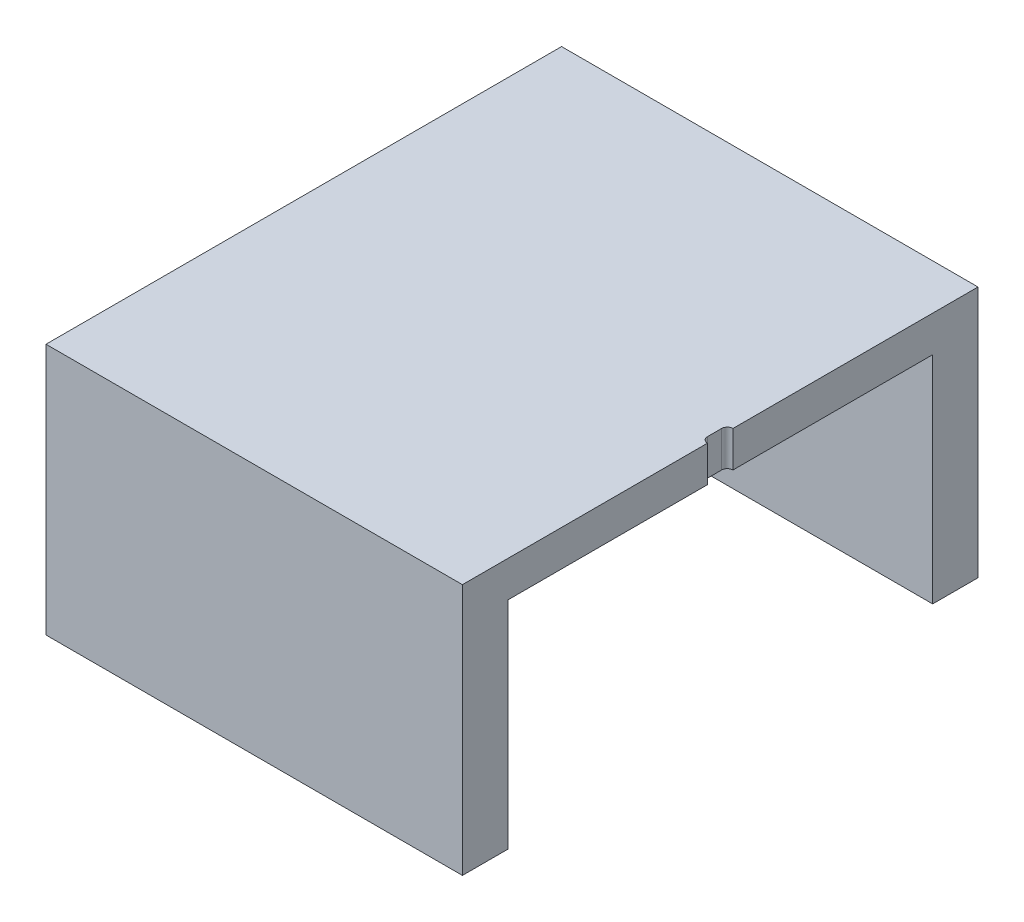
ISO-10303-21;
HEADER;
FILE_DESCRIPTION(('STEP AP214'),'2;1');
FILE_NAME('part.step','',(''),(''),'','','');
FILE_SCHEMA(('AUTOMOTIVE_DESIGN { 1 0 10303 214 1 1 1 1 }'));
ENDSEC;
DATA;
#1=APPLICATION_CONTEXT('core data for automotive mechanical design processes');
#2=APPLICATION_PROTOCOL_DEFINITION('international standard','automotive_design',2000,#1);
#3=PRODUCT_CONTEXT('',#1,'mechanical');
#4=PRODUCT('Part','Part','',(#3));
#5=PRODUCT_RELATED_PRODUCT_CATEGORY('part','',(#4));
#6=PRODUCT_DEFINITION_FORMATION('','',#4);
#7=PRODUCT_DEFINITION_CONTEXT('part definition',#1,'design');
#8=PRODUCT_DEFINITION('design','',#6,#7);
#9=PRODUCT_DEFINITION_SHAPE('','',#8);
#10=(LENGTH_UNIT() NAMED_UNIT(*) SI_UNIT(.MILLI.,.METRE.));
#11=(NAMED_UNIT(*) PLANE_ANGLE_UNIT() SI_UNIT($,.RADIAN.));
#12=(NAMED_UNIT(*) SI_UNIT($,.STERADIAN.) SOLID_ANGLE_UNIT());
#13=UNCERTAINTY_MEASURE_WITH_UNIT(LENGTH_MEASURE(1.E-05),#10,'distance_accuracy_value','');
#14=(GEOMETRIC_REPRESENTATION_CONTEXT(3) GLOBAL_UNCERTAINTY_ASSIGNED_CONTEXT((#13)) GLOBAL_UNIT_ASSIGNED_CONTEXT((#10,
#11,#12)) REPRESENTATION_CONTEXT('',''));
#15=CARTESIAN_POINT('',(0.,0.,0.));
#16=DIRECTION('',(0.,0.,1.));
#17=DIRECTION('',(1.,0.,0.));
#18=AXIS2_PLACEMENT_3D('',#15,#16,#17);
#19=CARTESIAN_POINT('',(0.,19.05,41.5));
#20=DIRECTION('',(0.,0.,-1.));
#21=DIRECTION('',(-1.,0.,0.));
#22=AXIS2_PLACEMENT_3D('',#19,#20,#21);
#23=PLANE('',#22);
#24=DIRECTION('',(1.,0.,0.));
#25=VECTOR('',#24,1.);
#26=CARTESIAN_POINT('',(0.,0.,41.5));
#27=LINE('',#26,#25);
#28=CARTESIAN_POINT('',(-32.75,0.,41.5));
#29=VERTEX_POINT('',#28);
#30=CARTESIAN_POINT('',(0.,0.,41.5));
#31=VERTEX_POINT('',#30);
#32=EDGE_CURVE('E115',#29,#31,#27,.T.);
#33=ORIENTED_EDGE('',*,*,#32,.F.);
#34=DIRECTION('',(0.,-1.,0.));
#35=VECTOR('',#34,1.);
#36=CARTESIAN_POINT('',(-32.75,19.05,41.5));
#37=LINE('',#36,#35);
#38=CARTESIAN_POINT('',(-32.75,19.05,41.5));
#39=VERTEX_POINT('',#38);
#40=EDGE_CURVE('E11',#39,#29,#37,.T.);
#41=ORIENTED_EDGE('',*,*,#40,.F.);
#42=DIRECTION('',(1.,0.,0.));
#43=VECTOR('',#42,1.);
#44=CARTESIAN_POINT('',(0.,19.05,41.5));
#45=LINE('',#44,#43);
#46=CARTESIAN_POINT('',(0.,19.05,41.5));
#47=VERTEX_POINT('',#46);
#48=EDGE_CURVE('E116',#39,#47,#45,.T.);
#49=ORIENTED_EDGE('',*,*,#48,.T.);
#50=DIRECTION('',(0.,-1.,0.));
#51=VECTOR('',#50,1.);
#52=CARTESIAN_POINT('',(0.,19.05,41.5));
#53=LINE('',#52,#51);
#54=EDGE_CURVE('E100',#47,#31,#53,.T.);
#55=ORIENTED_EDGE('',*,*,#54,.T.);
#56=EDGE_LOOP('',(#33,#41,#49,#55));
#57=FACE_BOUND('',#56,.T.);
#58=ADVANCED_FACE('F42',(#57),#23,.T.);
#59=CARTESIAN_POINT('',(-32.75,19.05,0.));
#60=DIRECTION('',(1.,0.,0.));
#61=DIRECTION('',(0.,0.,-1.));
#62=AXIS2_PLACEMENT_3D('',#59,#60,#61);
#63=PLANE('',#62);
#64=DIRECTION('',(0.,0.,1.));
#65=VECTOR('',#64,1.);
#66=CARTESIAN_POINT('',(-32.75,0.,0.));
#67=LINE('',#66,#65);
#68=CARTESIAN_POINT('',(-32.75,0.,4.));
#69=VERTEX_POINT('',#68);
#70=EDGE_CURVE('E129',#69,#29,#67,.T.);
#71=ORIENTED_EDGE('',*,*,#70,.F.);
#72=DIRECTION('',(0.,-1.,0.));
#73=VECTOR('',#72,1.);
#74=CARTESIAN_POINT('',(-32.75,19.05,4.));
#75=LINE('',#74,#73);
#76=CARTESIAN_POINT('',(-32.75,19.05,4.));
#77=VERTEX_POINT('',#76);
#78=EDGE_CURVE('E50',#77,#69,#75,.T.);
#79=ORIENTED_EDGE('',*,*,#78,.F.);
#80=DIRECTION('',(0.,0.,1.));
#81=VECTOR('',#80,1.);
#82=CARTESIAN_POINT('',(-32.75,19.05,0.));
#83=LINE('',#82,#81);
#84=EDGE_CURVE('E57',#77,#39,#83,.T.);
#85=ORIENTED_EDGE('',*,*,#84,.T.);
#86=ORIENTED_EDGE('',*,*,#40,.T.);
#87=EDGE_LOOP('',(#71,#79,#85,#86));
#88=FACE_BOUND('',#87,.T.);
#89=ADVANCED_FACE('F241',(#88),#63,.T.);
#90=CARTESIAN_POINT('',(0.,19.05,4.));
#91=DIRECTION('',(0.,0.,1.));
#92=DIRECTION('',(1.,0.,0.));
#93=AXIS2_PLACEMENT_3D('',#90,#91,#92);
#94=PLANE('',#93);
#95=DIRECTION('',(-1.,0.,0.));
#96=VECTOR('',#95,1.);
#97=CARTESIAN_POINT('',(0.,0.,4.));
#98=LINE('',#97,#96);
#99=CARTESIAN_POINT('',(0.,0.,4.));
#100=VERTEX_POINT('',#99);
#101=EDGE_CURVE('E125',#100,#69,#98,.T.);
#102=ORIENTED_EDGE('',*,*,#101,.F.);
#103=DIRECTION('',(0.,-1.,0.));
#104=VECTOR('',#103,1.);
#105=CARTESIAN_POINT('',(0.,19.05,4.));
#106=LINE('',#105,#104);
#107=CARTESIAN_POINT('',(0.,19.05,4.));
#108=VERTEX_POINT('',#107);
#109=EDGE_CURVE('E537',#108,#100,#106,.T.);
#110=ORIENTED_EDGE('',*,*,#109,.F.);
#111=DIRECTION('',(-1.,0.,0.));
#112=VECTOR('',#111,1.);
#113=CARTESIAN_POINT('',(0.,19.05,4.));
#114=LINE('',#113,#112);
#115=EDGE_CURVE('E135',#108,#77,#114,.T.);
#116=ORIENTED_EDGE('',*,*,#115,.T.);
#117=ORIENTED_EDGE('',*,*,#78,.T.);
#118=EDGE_LOOP('',(#102,#110,#116,#117));
#119=FACE_BOUND('',#118,.T.);
#120=ADVANCED_FACE('F246',(#119),#94,.T.);
#121=CARTESIAN_POINT('',(0.,19.05,0.));
#122=DIRECTION('',(1.,0.,0.));
#123=DIRECTION('',(0.,0.,-1.));
#124=AXIS2_PLACEMENT_3D('',#121,#122,#123);
#125=PLANE('',#124);
#126=DIRECTION('',(0.,0.,1.));
#127=VECTOR('',#126,1.);
#128=CARTESIAN_POINT('',(0.,0.,0.));
#129=LINE('',#128,#127);
#130=CARTESIAN_POINT('',(0.,0.,0.));
#131=VERTEX_POINT('',#130);
#132=EDGE_CURVE('E118',#131,#100,#129,.T.);
#133=ORIENTED_EDGE('',*,*,#132,.F.);
#134=DIRECTION('',(0.,-1.,0.));
#135=VECTOR('',#134,1.);
#136=CARTESIAN_POINT('',(0.,19.05,0.));
#137=LINE('',#136,#135);
#138=CARTESIAN_POINT('',(0.,22.225,0.));
#139=VERTEX_POINT('',#138);
#140=EDGE_CURVE('E538',#139,#131,#137,.T.);
#141=ORIENTED_EDGE('',*,*,#140,.F.);
#142=DIRECTION('',(0.,0.,-1.));
#143=VECTOR('',#142,1.);
#144=CARTESIAN_POINT('',(0.,22.225,0.));
#145=LINE('',#144,#143);
#146=CARTESIAN_POINT('',(0.,22.225,21.625));
#147=VERTEX_POINT('',#146);
#148=EDGE_CURVE('E154',#147,#139,#145,.T.);
#149=ORIENTED_EDGE('',*,*,#148,.F.);
#150=DIRECTION('',(0.,-1.,0.));
#151=VECTOR('',#150,1.);
#152=CARTESIAN_POINT('',(0.,22.225,21.625));
#153=LINE('',#152,#151);
#154=CARTESIAN_POINT('',(0.,19.05,21.625));
#155=VERTEX_POINT('',#154);
#156=EDGE_CURVE('E147',#147,#155,#153,.T.);
#157=ORIENTED_EDGE('',*,*,#156,.T.);
#158=DIRECTION('',(0.,0.,-1.));
#159=VECTOR('',#158,1.);
#160=CARTESIAN_POINT('',(0.,19.05,0.));
#161=LINE('',#160,#159);
#162=EDGE_CURVE('E164',#155,#108,#161,.T.);
#163=ORIENTED_EDGE('',*,*,#162,.T.);
#164=ORIENTED_EDGE('',*,*,#109,.T.);
#165=EDGE_LOOP('',(#133,#141,#149,#157,#163,#164));
#166=FACE_BOUND('',#165,.T.);
#167=ADVANCED_FACE('F468',(#166),#125,.T.);
#168=CARTESIAN_POINT('',(0.,19.05,0.));
#169=DIRECTION('',(0.,0.,1.));
#170=DIRECTION('',(1.,0.,0.));
#171=AXIS2_PLACEMENT_3D('',#168,#169,#170);
#172=PLANE('',#171);
#173=DIRECTION('',(-1.,0.,0.));
#174=VECTOR('',#173,1.);
#175=CARTESIAN_POINT('',(0.,0.,0.));
#176=LINE('',#175,#174);
#177=CARTESIAN_POINT('',(-36.75,0.,0.));
#178=VERTEX_POINT('',#177);
#179=EDGE_CURVE('E124',#131,#178,#176,.T.);
#180=ORIENTED_EDGE('',*,*,#179,.T.);
#181=DIRECTION('',(0.,-1.,0.));
#182=VECTOR('',#181,1.);
#183=CARTESIAN_POINT('',(-36.75,19.05,0.));
#184=LINE('',#183,#182);
#185=CARTESIAN_POINT('',(-36.75,22.225,0.));
#186=VERTEX_POINT('',#185);
#187=EDGE_CURVE('E542',#186,#178,#184,.T.);
#188=ORIENTED_EDGE('',*,*,#187,.F.);
#189=DIRECTION('',(1.,0.,0.));
#190=VECTOR('',#189,1.);
#191=CARTESIAN_POINT('',(0.,22.225,0.));
#192=LINE('',#191,#190);
#193=EDGE_CURVE('E182',#186,#139,#192,.T.);
#194=ORIENTED_EDGE('',*,*,#193,.T.);
#195=ORIENTED_EDGE('',*,*,#140,.T.);
#196=EDGE_LOOP('',(#180,#188,#194,#195));
#197=FACE_BOUND('',#196,.T.);
#198=ADVANCED_FACE('F488',(#197),#172,.F.);
#199=CARTESIAN_POINT('',(-36.75,19.05,0.));
#200=DIRECTION('',(1.,0.,0.));
#201=DIRECTION('',(0.,0.,-1.));
#202=AXIS2_PLACEMENT_3D('',#199,#200,#201);
#203=PLANE('',#202);
#204=DIRECTION('',(0.,0.,1.));
#205=VECTOR('',#204,1.);
#206=CARTESIAN_POINT('',(-36.75,0.,0.));
#207=LINE('',#206,#205);
#208=CARTESIAN_POINT('',(-36.75,0.,45.5));
#209=VERTEX_POINT('',#208);
#210=EDGE_CURVE('E109',#178,#209,#207,.T.);
#211=ORIENTED_EDGE('',*,*,#210,.T.);
#212=DIRECTION('',(0.,-1.,0.));
#213=VECTOR('',#212,1.);
#214=CARTESIAN_POINT('',(-36.75,19.05,45.5));
#215=LINE('',#214,#213);
#216=CARTESIAN_POINT('',(-36.75,22.225,45.5));
#217=VERTEX_POINT('',#216);
#218=EDGE_CURVE('E99',#217,#209,#215,.T.);
#219=ORIENTED_EDGE('',*,*,#218,.F.);
#220=DIRECTION('',(0.,0.,-1.));
#221=VECTOR('',#220,1.);
#222=CARTESIAN_POINT('',(-36.75,22.225,0.));
#223=LINE('',#222,#221);
#224=EDGE_CURVE('E179',#217,#186,#223,.T.);
#225=ORIENTED_EDGE('',*,*,#224,.T.);
#226=ORIENTED_EDGE('',*,*,#187,.T.);
#227=EDGE_LOOP('',(#211,#219,#225,#226));
#228=FACE_BOUND('',#227,.T.);
#229=ADVANCED_FACE('F477',(#228),#203,.F.);
#230=CARTESIAN_POINT('',(0.,19.05,45.5));
#231=DIRECTION('',(0.,0.,1.));
#232=DIRECTION('',(1.,0.,0.));
#233=AXIS2_PLACEMENT_3D('',#230,#231,#232);
#234=PLANE('',#233);
#235=DIRECTION('',(-1.,0.,0.));
#236=VECTOR('',#235,1.);
#237=CARTESIAN_POINT('',(0.,0.,45.5));
#238=LINE('',#237,#236);
#239=CARTESIAN_POINT('',(0.,0.,45.5));
#240=VERTEX_POINT('',#239);
#241=EDGE_CURVE('E103',#240,#209,#238,.T.);
#242=ORIENTED_EDGE('',*,*,#241,.F.);
#243=DIRECTION('',(0.,-1.,0.));
#244=VECTOR('',#243,1.);
#245=CARTESIAN_POINT('',(0.,19.05,45.5));
#246=LINE('',#245,#244);
#247=CARTESIAN_POINT('',(0.,22.225,45.5));
#248=VERTEX_POINT('',#247);
#249=EDGE_CURVE('E86',#248,#240,#246,.T.);
#250=ORIENTED_EDGE('',*,*,#249,.F.);
#251=DIRECTION('',(1.,0.,0.));
#252=VECTOR('',#251,1.);
#253=CARTESIAN_POINT('',(0.,22.225,45.5));
#254=LINE('',#253,#252);
#255=EDGE_CURVE('E177',#217,#248,#254,.T.);
#256=ORIENTED_EDGE('',*,*,#255,.F.);
#257=ORIENTED_EDGE('',*,*,#218,.T.);
#258=EDGE_LOOP('',(#242,#250,#256,#257));
#259=FACE_BOUND('',#258,.T.);
#260=ADVANCED_FACE('F104',(#259),#234,.T.);
#261=EDGE_CURVE('E91',#31,#240,#129,.T.);
#262=ORIENTED_EDGE('',*,*,#261,.F.);
#263=ORIENTED_EDGE('',*,*,#54,.F.);
#264=DIRECTION('',(0.,0.,-1.));
#265=VECTOR('',#264,1.);
#266=CARTESIAN_POINT('',(0.,19.05,0.));
#267=LINE('',#266,#265);
#268=CARTESIAN_POINT('',(0.,19.05,23.875));
#269=VERTEX_POINT('',#268);
#270=EDGE_CURVE('E161',#47,#269,#267,.T.);
#271=ORIENTED_EDGE('',*,*,#270,.T.);
#272=DIRECTION('',(0.,-1.,0.));
#273=VECTOR('',#272,1.);
#274=CARTESIAN_POINT('',(0.,22.225,23.875));
#275=LINE('',#274,#273);
#276=CARTESIAN_POINT('',(0.,22.225,23.875));
#277=VERTEX_POINT('',#276);
#278=EDGE_CURVE('E134',#277,#269,#275,.T.);
#279=ORIENTED_EDGE('',*,*,#278,.F.);
#280=DIRECTION('',(0.,0.,-1.));
#281=VECTOR('',#280,1.);
#282=CARTESIAN_POINT('',(0.,22.225,0.));
#283=LINE('',#282,#281);
#284=EDGE_CURVE('E95',#248,#277,#283,.T.);
#285=ORIENTED_EDGE('',*,*,#284,.F.);
#286=ORIENTED_EDGE('',*,*,#249,.T.);
#287=EDGE_LOOP('',(#262,#263,#271,#279,#285,#286));
#288=FACE_BOUND('',#287,.T.);
#289=ADVANCED_FACE('F88',(#288),#125,.T.);
#290=CARTESIAN_POINT('',(0.,0.,0.));
#291=DIRECTION('',(0.,1.,0.));
#292=DIRECTION('',(0.,0.,1.));
#293=AXIS2_PLACEMENT_3D('',#290,#291,#292);
#294=PLANE('',#293);
#295=CARTESIAN_POINT('',(-9.99999999999999,0.,43.));
#296=DIRECTION('',(0.,-1.,0.));
#297=DIRECTION('',(0.,0.,-1.));
#298=AXIS2_PLACEMENT_3D('',#295,#296,#297);
#299=CIRCLE('',#298,0.888999999999989);
#300=CARTESIAN_POINT('',(-9.99999999999999,0.,42.111));
#301=VERTEX_POINT('',#300);
#302=EDGE_CURVE('E207',#301,#301,#299,.T.);
#303=ORIENTED_EDGE('',*,*,#302,.F.);
#304=EDGE_LOOP('',(#303));
#305=FACE_BOUND('',#304,.T.);
#306=CARTESIAN_POINT('',(-34.25,0.,43.));
#307=DIRECTION('',(0.,-1.,0.));
#308=DIRECTION('',(0.,0.,-1.));
#309=AXIS2_PLACEMENT_3D('',#306,#307,#308);
#310=CIRCLE('',#309,0.888999999999987);
#311=CARTESIAN_POINT('',(-34.25,0.,42.111));
#312=VERTEX_POINT('',#311);
#313=EDGE_CURVE('E201',#312,#312,#310,.T.);
#314=ORIENTED_EDGE('',*,*,#313,.F.);
#315=EDGE_LOOP('',(#314));
#316=FACE_BOUND('',#315,.T.);
#317=CARTESIAN_POINT('',(-34.25,0.,2.5));
#318=DIRECTION('',(0.,-1.,0.));
#319=DIRECTION('',(0.,0.,-1.));
#320=AXIS2_PLACEMENT_3D('',#317,#318,#319);
#321=CIRCLE('',#320,0.888999999999987);
#322=CARTESIAN_POINT('',(-34.25,0.,1.61100000000002));
#323=VERTEX_POINT('',#322);
#324=EDGE_CURVE('E195',#323,#323,#321,.T.);
#325=ORIENTED_EDGE('',*,*,#324,.F.);
#326=EDGE_LOOP('',(#325));
#327=FACE_BOUND('',#326,.T.);
#328=CARTESIAN_POINT('',(-10.,0.,2.5));
#329=DIRECTION('',(0.,-1.,0.));
#330=DIRECTION('',(0.,0.,-1.));
#331=AXIS2_PLACEMENT_3D('',#328,#329,#330);
#332=CIRCLE('',#331,0.888999999999989);
#333=CARTESIAN_POINT('',(-10.,0.,1.61100000000002));
#334=VERTEX_POINT('',#333);
#335=EDGE_CURVE('E189',#334,#334,#332,.T.);
#336=ORIENTED_EDGE('',*,*,#335,.F.);
#337=EDGE_LOOP('',(#336));
#338=FACE_BOUND('',#337,.T.);
#339=ORIENTED_EDGE('',*,*,#32,.T.);
#340=ORIENTED_EDGE('',*,*,#261,.T.);
#341=ORIENTED_EDGE('',*,*,#241,.T.);
#342=ORIENTED_EDGE('',*,*,#210,.F.);
#343=ORIENTED_EDGE('',*,*,#179,.F.);
#344=ORIENTED_EDGE('',*,*,#132,.T.);
#345=ORIENTED_EDGE('',*,*,#101,.T.);
#346=ORIENTED_EDGE('',*,*,#70,.T.);
#347=EDGE_LOOP('',(#339,#340,#341,#342,#343,#344,#345,#346));
#348=FACE_BOUND('',#347,.T.);
#349=ADVANCED_FACE('F112',(#305,#316,#327,#338,#348),#294,.F.);
#350=CARTESIAN_POINT('',(0.,22.225,23.375));
#351=DIRECTION('',(0.,-1.,0.));
#352=DIRECTION('',(0.,0.,-1.));
#353=AXIS2_PLACEMENT_3D('',#350,#351,#352);
#354=CYLINDRICAL_SURFACE('',#353,0.499999999999994);
#355=CARTESIAN_POINT('',(0.,19.05,23.375));
#356=DIRECTION('',(0.,1.,0.));
#357=DIRECTION('',(0.,0.,1.));
#358=AXIS2_PLACEMENT_3D('',#355,#356,#357);
#359=CIRCLE('',#358,0.499999999999994);
#360=CARTESIAN_POINT('',(-0.499999999999991,19.05,23.375));
#361=VERTEX_POINT('',#360);
#362=EDGE_CURVE('E158',#361,#269,#359,.T.);
#363=ORIENTED_EDGE('',*,*,#362,.F.);
#364=DIRECTION('',(0.,-1.,0.));
#365=VECTOR('',#364,1.);
#366=CARTESIAN_POINT('',(-0.499999999999991,22.225,23.375));
#367=LINE('',#366,#365);
#368=CARTESIAN_POINT('',(-0.499999999999991,22.225,23.375));
#369=VERTEX_POINT('',#368);
#370=EDGE_CURVE('E141',#369,#361,#367,.T.);
#371=ORIENTED_EDGE('',*,*,#370,.F.);
#372=CARTESIAN_POINT('',(0.,22.225,23.375));
#373=DIRECTION('',(0.,1.,0.));
#374=DIRECTION('',(0.,0.,1.));
#375=AXIS2_PLACEMENT_3D('',#372,#373,#374);
#376=CIRCLE('',#375,0.499999999999994);
#377=EDGE_CURVE('E173',#369,#277,#376,.T.);
#378=ORIENTED_EDGE('',*,*,#377,.T.);
#379=ORIENTED_EDGE('',*,*,#278,.T.);
#380=EDGE_LOOP('',(#363,#371,#378,#379));
#381=FACE_BOUND('',#380,.T.);
#382=ADVANCED_FACE('F215',(#381),#354,.F.);
#383=CARTESIAN_POINT('',(-0.499999999999993,22.225,0.));
#384=DIRECTION('',(-1.,0.,0.));
#385=DIRECTION('',(0.,0.,1.));
#386=AXIS2_PLACEMENT_3D('',#383,#384,#385);
#387=PLANE('',#386);
#388=DIRECTION('',(0.,0.,-1.));
#389=VECTOR('',#388,1.);
#390=CARTESIAN_POINT('',(-0.499999999999993,19.05,0.));
#391=LINE('',#390,#389);
#392=CARTESIAN_POINT('',(-0.499999999999997,19.05,22.125));
#393=VERTEX_POINT('',#392);
#394=EDGE_CURVE('E155',#361,#393,#391,.T.);
#395=ORIENTED_EDGE('',*,*,#394,.T.);
#396=DIRECTION('',(0.,-1.,0.));
#397=VECTOR('',#396,1.);
#398=CARTESIAN_POINT('',(-0.499999999999997,22.225,22.125));
#399=LINE('',#398,#397);
#400=CARTESIAN_POINT('',(-0.499999999999997,22.225,22.125));
#401=VERTEX_POINT('',#400);
#402=EDGE_CURVE('E144',#401,#393,#399,.T.);
#403=ORIENTED_EDGE('',*,*,#402,.F.);
#404=DIRECTION('',(0.,0.,-1.));
#405=VECTOR('',#404,1.);
#406=CARTESIAN_POINT('',(-0.499999999999993,22.225,0.));
#407=LINE('',#406,#405);
#408=EDGE_CURVE('E170',#369,#401,#407,.T.);
#409=ORIENTED_EDGE('',*,*,#408,.F.);
#410=ORIENTED_EDGE('',*,*,#370,.T.);
#411=EDGE_LOOP('',(#395,#403,#409,#410));
#412=FACE_BOUND('',#411,.T.);
#413=ADVANCED_FACE('F397',(#412),#387,.F.);
#414=CARTESIAN_POINT('',(0.,22.225,22.125));
#415=DIRECTION('',(0.,-1.,0.));
#416=DIRECTION('',(0.,0.,-1.));
#417=AXIS2_PLACEMENT_3D('',#414,#415,#416);
#418=CYLINDRICAL_SURFACE('',#417,0.499999999999994);
#419=CARTESIAN_POINT('',(0.,19.05,22.125));
#420=DIRECTION('',(0.,1.,0.));
#421=DIRECTION('',(0.,0.,1.));
#422=AXIS2_PLACEMENT_3D('',#419,#420,#421);
#423=CIRCLE('',#422,0.499999999999994);
#424=EDGE_CURVE('E151',#155,#393,#423,.T.);
#425=ORIENTED_EDGE('',*,*,#424,.F.);
#426=ORIENTED_EDGE('',*,*,#156,.F.);
#427=CARTESIAN_POINT('',(0.,22.225,22.125));
#428=DIRECTION('',(0.,1.,0.));
#429=DIRECTION('',(0.,0.,1.));
#430=AXIS2_PLACEMENT_3D('',#427,#428,#429);
#431=CIRCLE('',#430,0.499999999999994);
#432=EDGE_CURVE('E150',#147,#401,#431,.T.);
#433=ORIENTED_EDGE('',*,*,#432,.T.);
#434=ORIENTED_EDGE('',*,*,#402,.T.);
#435=EDGE_LOOP('',(#425,#426,#433,#434));
#436=FACE_BOUND('',#435,.T.);
#437=ADVANCED_FACE('F405',(#436),#418,.F.);
#438=CARTESIAN_POINT('',(0.,22.225,23.375));
#439=DIRECTION('',(0.,1.,0.));
#440=DIRECTION('',(0.,0.,1.));
#441=AXIS2_PLACEMENT_3D('',#438,#439,#440);
#442=PLANE('',#441);
#443=ORIENTED_EDGE('',*,*,#148,.T.);
#444=ORIENTED_EDGE('',*,*,#193,.F.);
#445=ORIENTED_EDGE('',*,*,#224,.F.);
#446=ORIENTED_EDGE('',*,*,#255,.T.);
#447=ORIENTED_EDGE('',*,*,#284,.T.);
#448=ORIENTED_EDGE('',*,*,#377,.F.);
#449=ORIENTED_EDGE('',*,*,#408,.T.);
#450=ORIENTED_EDGE('',*,*,#432,.F.);
#451=EDGE_LOOP('',(#443,#444,#445,#446,#447,#448,#449,#450));
#452=FACE_BOUND('',#451,.T.);
#453=ADVANCED_FACE('F413',(#452),#442,.T.);
#454=CARTESIAN_POINT('',(0.,19.05,23.375));
#455=DIRECTION('',(0.,1.,0.));
#456=DIRECTION('',(0.,0.,1.));
#457=AXIS2_PLACEMENT_3D('',#454,#455,#456);
#458=PLANE('',#457);
#459=ORIENTED_EDGE('',*,*,#48,.F.);
#460=ORIENTED_EDGE('',*,*,#84,.F.);
#461=ORIENTED_EDGE('',*,*,#115,.F.);
#462=ORIENTED_EDGE('',*,*,#162,.F.);
#463=ORIENTED_EDGE('',*,*,#424,.T.);
#464=ORIENTED_EDGE('',*,*,#394,.F.);
#465=ORIENTED_EDGE('',*,*,#362,.T.);
#466=ORIENTED_EDGE('',*,*,#270,.F.);
#467=EDGE_LOOP('',(#459,#460,#461,#462,#463,#464,#465,#466));
#468=FACE_BOUND('',#467,.T.);
#469=ADVANCED_FACE('F236',(#468),#458,.F.);
#470=CARTESIAN_POINT('',(-10.,5.73,2.5));
#471=DIRECTION('',(0.,-1.,0.));
#472=DIRECTION('',(0.,0.,-1.));
#473=AXIS2_PLACEMENT_3D('',#470,#471,#472);
#474=CONICAL_SURFACE('',#473,0.888999999999999,1.02974425867665);
#475=CARTESIAN_POINT('',(-10.,6.2641650903155,2.5));
#476=VERTEX_POINT('',#475);
#477=VERTEX_LOOP('',#476);
#478=FACE_BOUND('',#477,.T.);
#479=CARTESIAN_POINT('',(-10.,5.73,2.5));
#480=DIRECTION('',(0.,-1.,0.));
#481=DIRECTION('',(0.,0.,-1.));
#482=AXIS2_PLACEMENT_3D('',#479,#480,#481);
#483=CIRCLE('',#482,0.888999999999999);
#484=CARTESIAN_POINT('',(-10.,5.73,1.611));
#485=VERTEX_POINT('',#484);
#486=EDGE_CURVE('E167',#485,#485,#483,.T.);
#487=ORIENTED_EDGE('',*,*,#486,.T.);
#488=EDGE_LOOP('',(#487));
#489=FACE_BOUND('',#488,.T.);
#490=ADVANCED_FACE('F226',(#478,#489),#474,.F.);
#491=CARTESIAN_POINT('',(-10.,0.,2.5));
#492=DIRECTION('',(0.,-1.,0.));
#493=DIRECTION('',(0.,0.,-1.));
#494=AXIS2_PLACEMENT_3D('',#491,#492,#493);
#495=CYLINDRICAL_SURFACE('',#494,0.888999999999994);
#496=ORIENTED_EDGE('',*,*,#486,.F.);
#497=EDGE_LOOP('',(#496));
#498=FACE_BOUND('',#497,.T.);
#499=ORIENTED_EDGE('',*,*,#335,.T.);
#500=EDGE_LOOP('',(#499));
#501=FACE_BOUND('',#500,.T.);
#502=ADVANCED_FACE('F223',(#498,#501),#495,.F.);
#503=CARTESIAN_POINT('',(-34.25,5.73,2.5));
#504=DIRECTION('',(0.,-1.,0.));
#505=DIRECTION('',(0.,0.,-1.));
#506=AXIS2_PLACEMENT_3D('',#503,#504,#505);
#507=CONICAL_SURFACE('',#506,0.889000000000001,1.02974425867665);
#508=CARTESIAN_POINT('',(-34.25,6.2641650903155,2.5));
#509=VERTEX_POINT('',#508);
#510=VERTEX_LOOP('',#509);
#511=FACE_BOUND('',#510,.T.);
#512=CARTESIAN_POINT('',(-34.25,5.73,2.5));
#513=DIRECTION('',(0.,-1.,0.));
#514=DIRECTION('',(0.,0.,-1.));
#515=AXIS2_PLACEMENT_3D('',#512,#513,#514);
#516=CIRCLE('',#515,0.889000000000001);
#517=CARTESIAN_POINT('',(-34.25,5.73,1.611));
#518=VERTEX_POINT('',#517);
#519=EDGE_CURVE('E192',#518,#518,#516,.T.);
#520=ORIENTED_EDGE('',*,*,#519,.T.);
#521=EDGE_LOOP('',(#520));
#522=FACE_BOUND('',#521,.T.);
#523=ADVANCED_FACE('F225',(#511,#522),#507,.F.);
#524=CARTESIAN_POINT('',(-34.25,0.,2.5));
#525=DIRECTION('',(0.,-1.,0.));
#526=DIRECTION('',(0.,0.,-1.));
#527=AXIS2_PLACEMENT_3D('',#524,#525,#526);
#528=CYLINDRICAL_SURFACE('',#527,0.888999999999994);
#529=ORIENTED_EDGE('',*,*,#519,.F.);
#530=EDGE_LOOP('',(#529));
#531=FACE_BOUND('',#530,.T.);
#532=ORIENTED_EDGE('',*,*,#324,.T.);
#533=EDGE_LOOP('',(#532));
#534=FACE_BOUND('',#533,.T.);
#535=ADVANCED_FACE('F233',(#531,#534),#528,.F.);
#536=CARTESIAN_POINT('',(-34.25,5.73,43.));
#537=DIRECTION('',(0.,-1.,0.));
#538=DIRECTION('',(0.,0.,-1.));
#539=AXIS2_PLACEMENT_3D('',#536,#537,#538);
#540=CONICAL_SURFACE('',#539,0.889000000000001,1.02974425867665);
#541=CARTESIAN_POINT('',(-34.25,6.2641650903155,43.));
#542=VERTEX_POINT('',#541);
#543=VERTEX_LOOP('',#542);
#544=FACE_BOUND('',#543,.T.);
#545=CARTESIAN_POINT('',(-34.25,5.73,43.));
#546=DIRECTION('',(0.,-1.,0.));
#547=DIRECTION('',(0.,0.,-1.));
#548=AXIS2_PLACEMENT_3D('',#545,#546,#547);
#549=CIRCLE('',#548,0.889000000000001);
#550=CARTESIAN_POINT('',(-34.25,5.73,42.111));
#551=VERTEX_POINT('',#550);
#552=EDGE_CURVE('E198',#551,#551,#549,.T.);
#553=ORIENTED_EDGE('',*,*,#552,.T.);
#554=EDGE_LOOP('',(#553));
#555=FACE_BOUND('',#554,.T.);
#556=ADVANCED_FACE('F308',(#544,#555),#540,.F.);
#557=CARTESIAN_POINT('',(-34.25,0.,43.));
#558=DIRECTION('',(0.,-1.,0.));
#559=DIRECTION('',(0.,0.,-1.));
#560=AXIS2_PLACEMENT_3D('',#557,#558,#559);
#561=CYLINDRICAL_SURFACE('',#560,0.888999999999994);
#562=ORIENTED_EDGE('',*,*,#552,.F.);
#563=EDGE_LOOP('',(#562));
#564=FACE_BOUND('',#563,.T.);
#565=ORIENTED_EDGE('',*,*,#313,.T.);
#566=EDGE_LOOP('',(#565));
#567=FACE_BOUND('',#566,.T.);
#568=ADVANCED_FACE('F297',(#564,#567),#561,.F.);
#569=CARTESIAN_POINT('',(-9.99999999999999,5.73,43.));
#570=DIRECTION('',(0.,-1.,0.));
#571=DIRECTION('',(0.,0.,-1.));
#572=AXIS2_PLACEMENT_3D('',#569,#570,#571);
#573=CONICAL_SURFACE('',#572,0.888999999999999,1.02974425867665);
#574=CARTESIAN_POINT('',(-10.,6.2641650903155,43.));
#575=VERTEX_POINT('',#574);
#576=VERTEX_LOOP('',#575);
#577=FACE_BOUND('',#576,.T.);
#578=CARTESIAN_POINT('',(-9.99999999999999,5.73,43.));
#579=DIRECTION('',(0.,-1.,0.));
#580=DIRECTION('',(0.,0.,-1.));
#581=AXIS2_PLACEMENT_3D('',#578,#579,#580);
#582=CIRCLE('',#581,0.888999999999999);
#583=CARTESIAN_POINT('',(-9.99999999999999,5.73,42.111));
#584=VERTEX_POINT('',#583);
#585=EDGE_CURVE('E204',#584,#584,#582,.T.);
#586=ORIENTED_EDGE('',*,*,#585,.T.);
#587=EDGE_LOOP('',(#586));
#588=FACE_BOUND('',#587,.T.);
#589=ADVANCED_FACE('F294',(#577,#588),#573,.F.);
#590=CARTESIAN_POINT('',(-9.99999999999999,0.,43.));
#591=DIRECTION('',(0.,-1.,0.));
#592=DIRECTION('',(0.,0.,-1.));
#593=AXIS2_PLACEMENT_3D('',#590,#591,#592);
#594=CYLINDRICAL_SURFACE('',#593,0.888999999999994);
#595=ORIENTED_EDGE('',*,*,#585,.F.);
#596=EDGE_LOOP('',(#595));
#597=FACE_BOUND('',#596,.T.);
#598=ORIENTED_EDGE('',*,*,#302,.T.);
#599=EDGE_LOOP('',(#598));
#600=FACE_BOUND('',#599,.T.);
#601=ADVANCED_FACE('F211',(#597,#600),#594,.F.);
#602=CLOSED_SHELL('',(#58,#89,#120,#167,#198,#229,#260,#289,#349,#382,#413,#437,#453,#469,#490,
#502,#523,#535,#556,#568,#589,#601));
#603=MANIFOLD_SOLID_BREP('B2',#602);
#604=ADVANCED_BREP_SHAPE_REPRESENTATION('',(#18,#603),#14);
#605=SHAPE_DEFINITION_REPRESENTATION(#9,#604);
ENDSEC;
END-ISO-10303-21;
